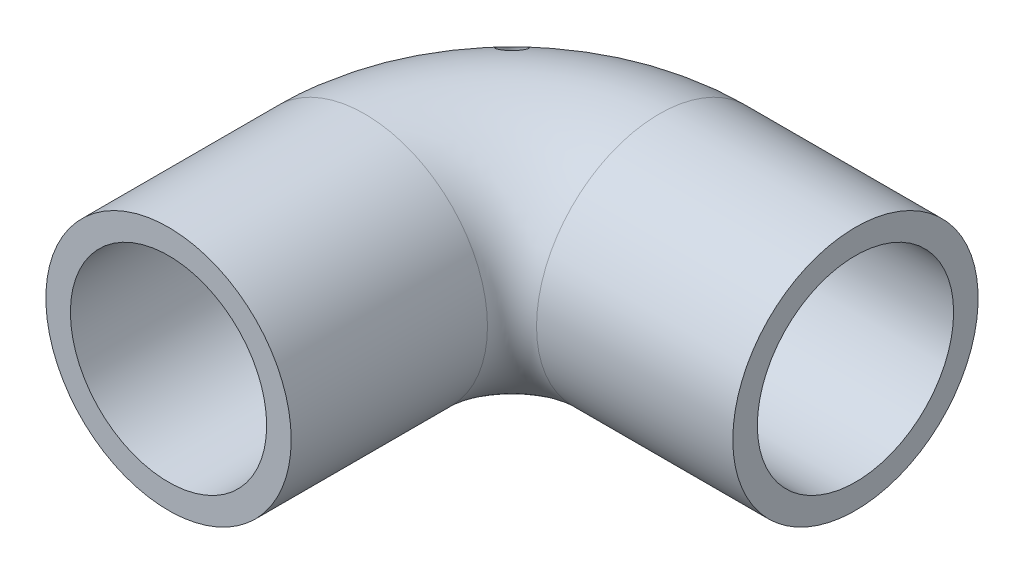
ISO-10303-21;
HEADER;
FILE_DESCRIPTION(('STEP AP214'),'2;1');
FILE_NAME('part.step','',(''),(''),'','','');
FILE_SCHEMA(('AUTOMOTIVE_DESIGN { 1 0 10303 214 1 1 1 1 }'));
ENDSEC;
DATA;
#1=APPLICATION_CONTEXT('core data for automotive mechanical design processes');
#2=APPLICATION_PROTOCOL_DEFINITION('international standard','automotive_design',2000,#1);
#3=PRODUCT_CONTEXT('',#1,'mechanical');
#4=PRODUCT('Part','Part','',(#3));
#5=PRODUCT_RELATED_PRODUCT_CATEGORY('part','',(#4));
#6=PRODUCT_DEFINITION_FORMATION('','',#4);
#7=PRODUCT_DEFINITION_CONTEXT('part definition',#1,'design');
#8=PRODUCT_DEFINITION('design','',#6,#7);
#9=PRODUCT_DEFINITION_SHAPE('','',#8);
#10=(LENGTH_UNIT() NAMED_UNIT(*) SI_UNIT(.MILLI.,.METRE.));
#11=(NAMED_UNIT(*) PLANE_ANGLE_UNIT() SI_UNIT($,.RADIAN.));
#12=(NAMED_UNIT(*) SI_UNIT($,.STERADIAN.) SOLID_ANGLE_UNIT());
#13=UNCERTAINTY_MEASURE_WITH_UNIT(LENGTH_MEASURE(1.E-05),#10,'distance_accuracy_value','');
#14=(GEOMETRIC_REPRESENTATION_CONTEXT(3) GLOBAL_UNCERTAINTY_ASSIGNED_CONTEXT((#13)) GLOBAL_UNIT_ASSIGNED_CONTEXT((#10,
#11,#12)) REPRESENTATION_CONTEXT('',''));
#15=CARTESIAN_POINT('',(0.,0.,0.));
#16=DIRECTION('',(0.,0.,1.));
#17=DIRECTION('',(1.,0.,0.));
#18=AXIS2_PLACEMENT_3D('',#15,#16,#17);
#19=CARTESIAN_POINT('',(70.,0.,20.));
#20=DIRECTION('',(-1.,0.,0.));
#21=DIRECTION('',(0.,0.,1.));
#22=AXIS2_PLACEMENT_3D('',#19,#20,#21);
#23=PLANE('',#22);
#24=CARTESIAN_POINT('',(70.,0.,20.));
#25=DIRECTION('',(-1.,0.,0.));
#26=DIRECTION('',(0.,0.,1.));
#27=AXIS2_PLACEMENT_3D('',#24,#25,#26);
#28=CIRCLE('',#27,20.);
#29=CARTESIAN_POINT('',(70.,0.,40.));
#30=VERTEX_POINT('',#29);
#31=EDGE_CURVE('E121',#30,#30,#28,.T.);
#32=ORIENTED_EDGE('',*,*,#31,.T.);
#33=EDGE_LOOP('',(#32));
#34=FACE_BOUND('',#33,.T.);
#35=CARTESIAN_POINT('',(70.,0.,20.));
#36=DIRECTION('',(-1.,0.,0.));
#37=DIRECTION('',(0.,0.,1.));
#38=AXIS2_PLACEMENT_3D('',#35,#36,#37);
#39=CIRCLE('',#38,25.);
#40=CARTESIAN_POINT('',(70.,0.,45.));
#41=VERTEX_POINT('',#40);
#42=EDGE_CURVE('E50',#41,#41,#39,.T.);
#43=ORIENTED_EDGE('',*,*,#42,.F.);
#44=EDGE_LOOP('',(#43));
#45=FACE_BOUND('',#44,.T.);
#46=ADVANCED_FACE('F32',(#34,#45),#23,.F.);
#47=CARTESIAN_POINT('',(0.,0.,90.));
#48=DIRECTION('',(0.,0.,1.));
#49=DIRECTION('',(1.,0.,0.));
#50=AXIS2_PLACEMENT_3D('',#47,#48,#49);
#51=PLANE('',#50);
#52=CARTESIAN_POINT('',(0.,0.,90.));
#53=DIRECTION('',(0.,0.,1.));
#54=DIRECTION('',(1.,0.,0.));
#55=AXIS2_PLACEMENT_3D('',#52,#53,#54);
#56=CIRCLE('',#55,20.);
#57=CARTESIAN_POINT('',(20.,0.,90.));
#58=VERTEX_POINT('',#57);
#59=EDGE_CURVE('E113',#58,#58,#56,.T.);
#60=ORIENTED_EDGE('',*,*,#59,.F.);
#61=EDGE_LOOP('',(#60));
#62=FACE_BOUND('',#61,.T.);
#63=CARTESIAN_POINT('',(0.,0.,90.));
#64=DIRECTION('',(0.,0.,1.));
#65=DIRECTION('',(1.,0.,0.));
#66=AXIS2_PLACEMENT_3D('',#63,#64,#65);
#67=CIRCLE('',#66,25.);
#68=CARTESIAN_POINT('',(25.,0.,90.));
#69=VERTEX_POINT('',#68);
#70=EDGE_CURVE('E11',#69,#69,#67,.T.);
#71=ORIENTED_EDGE('',*,*,#70,.T.);
#72=EDGE_LOOP('',(#71));
#73=FACE_BOUND('',#72,.T.);
#74=ADVANCED_FACE('F53',(#62,#73),#51,.T.);
#75=CARTESIAN_POINT('',(70.,0.,20.));
#76=DIRECTION('',(-1.,0.,0.));
#77=DIRECTION('',(0.,0.,1.));
#78=AXIS2_PLACEMENT_3D('',#75,#76,#77);
#79=CYLINDRICAL_SURFACE('',#78,25.);
#80=CARTESIAN_POINT('',(30.,0.,20.));
#81=DIRECTION('',(-1.,0.,0.));
#82=DIRECTION('',(0.,0.,1.));
#83=AXIS2_PLACEMENT_3D('',#80,#81,#82);
#84=CIRCLE('',#83,25.);
#85=CARTESIAN_POINT('',(30.,0.,45.));
#86=VERTEX_POINT('',#85);
#87=EDGE_CURVE('E64',#86,#86,#84,.T.);
#88=ORIENTED_EDGE('',*,*,#87,.F.);
#89=EDGE_LOOP('',(#88));
#90=FACE_BOUND('',#89,.T.);
#91=ORIENTED_EDGE('',*,*,#42,.T.);
#92=EDGE_LOOP('',(#91));
#93=FACE_BOUND('',#92,.T.);
#94=ADVANCED_FACE('F99',(#90,#93),#79,.T.);
#95=CARTESIAN_POINT('',(30.,0.,50.));
#96=DIRECTION('',(0.,1.,0.));
#97=DIRECTION('',(0.,0.,1.));
#98=AXIS2_PLACEMENT_3D('',#95,#96,#97);
#99=TOROIDAL_SURFACE('',#98,30.,25.);
#100=CARTESIAN_POINT('',(-1.44231619319883,-21.8907451970835,22.0419902053723));
#101=CARTESIAN_POINT('',(-1.59508578838387,-21.7882153988896,21.9340750168318));
#102=CARTESIAN_POINT('',(-1.73436957035043,-21.6821850677874,21.8099608458581));
#103=CARTESIAN_POINT('',(-1.98162230161785,-21.4672130325082,21.535394866236));
#104=CARTESIAN_POINT('',(-2.0895241645288,-21.3582656271351,21.384887720601));
#105=CARTESIAN_POINT('',(-2.25866809224152,-21.1556949394587,21.0836694362793));
#106=CARTESIAN_POINT('',(-2.32410086612629,-21.0618860957824,20.9354222697774));
#107=CARTESIAN_POINT('',(-2.42559527596869,-20.8787529766887,20.6267514395709));
#108=CARTESIAN_POINT('',(-2.46170113931035,-20.7894221396998,20.4663465117152));
#109=CARTESIAN_POINT('',(-2.498229598444,-20.6340445621157,20.1660455558691));
#110=CARTESIAN_POINT('',(-2.50378455590554,-20.566656629428,20.0274628877253));
#111=CARTESIAN_POINT('',(-2.49114886864304,-20.4403720006482,19.747503379492));
#112=CARTESIAN_POINT('',(-2.47298262007246,-20.381466649755,19.6061295571664));
#113=CARTESIAN_POINT('',(-2.41619155197144,-20.2838083907406,19.3467346983942));
#114=CARTESIAN_POINT('',(-2.38125554539665,-20.2433417428258,19.2285555040712));
#115=CARTESIAN_POINT('',(-2.29290292519107,-20.1728764511586,18.99598888701));
#116=CARTESIAN_POINT('',(-2.23949557655604,-20.1428725745335,18.8815995947646));
#117=CARTESIAN_POINT('',(-2.11419281334532,-20.0951849793816,18.6596613412832));
#118=CARTESIAN_POINT('',(-2.04219483273119,-20.0775716954466,18.5521545946519));
#119=CARTESIAN_POINT('',(-1.88157567237492,-20.056365810975,18.3488092571606));
#120=CARTESIAN_POINT('',(-1.79296266894897,-20.0527663330724,18.2529649652541));
#121=CARTESIAN_POINT('',(-1.61170702174315,-20.0595133256802,18.0852888968907));
#122=CARTESIAN_POINT('',(-1.52033473502802,-20.0685126317721,18.0120185704128));
#123=CARTESIAN_POINT('',(-1.32947641184281,-20.0974805160227,17.8796269624619));
#124=CARTESIAN_POINT('',(-1.22999014163988,-20.1174494102684,17.8205060887736));
#125=CARTESIAN_POINT('',(-1.02494004218014,-20.1673515069452,17.7168387467434));
#126=CARTESIAN_POINT('',(-0.919329690103732,-20.1973725090683,17.6724278109711));
#127=CARTESIAN_POINT('',(-0.705541118843986,-20.2657543056126,17.5989577128579));
#128=CARTESIAN_POINT('',(-0.597362026260551,-20.3041179738763,17.5699038525116));
#129=CARTESIAN_POINT('',(-0.367264288070406,-20.3927318609615,17.5240099030193));
#130=CARTESIAN_POINT('',(-0.245299595040571,-20.4438650872409,17.5091225649858));
#131=CARTESIAN_POINT('',(-0.00338335794798425,-20.5525182110665,17.4970655830426));
#132=CARTESIAN_POINT('',(0.116566979713132,-20.6100417890621,17.4999062018522));
#133=CARTESIAN_POINT('',(0.372861799437715,-20.7399493436596,17.524064069082));
#134=CARTESIAN_POINT('',(0.508482703812037,-20.8131885681392,17.5484715696204));
#135=CARTESIAN_POINT('',(0.771966665139713,-20.963518751281,17.6182635461716));
#136=CARTESIAN_POINT('',(0.899824885426074,-21.0406120578442,17.6636609515786));
#137=CARTESIAN_POINT('',(1.16372617211347,-21.208074729394,17.7819847057811));
#138=CARTESIAN_POINT('',(1.29822262886817,-21.2987339433947,17.8579704742899));
#139=CARTESIAN_POINT('',(1.55118933758139,-21.4798240195878,18.0333981891677));
#140=CARTESIAN_POINT('',(1.66965185794227,-21.5702547511266,18.1328513886194));
#141=CARTESIAN_POINT('',(1.89334267790564,-21.7534641371644,18.3592798304049));
#142=CARTESIAN_POINT('',(1.99746061481144,-21.8460913453407,18.4874830284147));
#143=CARTESIAN_POINT('',(2.17982468987654,-22.025605443651,18.7647383244829));
#144=CARTESIAN_POINT('',(2.25807494729769,-22.1124932459834,18.9137870976325));
#145=CARTESIAN_POINT('',(2.38074888365382,-22.2733278049602,19.2203635081484));
#146=CARTESIAN_POINT('',(2.42674261427841,-22.347715936813,19.3770258917309));
#147=CARTESIAN_POINT('',(2.48744861941868,-22.4863129490414,19.7006267563252));
#148=CARTESIAN_POINT('',(2.50218862742882,-22.5505308073029,19.8675559913912));
#149=CARTESIAN_POINT('',(2.49756894251179,-22.6595986140875,20.1854543799206));
#150=CARTESIAN_POINT('',(2.48200318938247,-22.7058363843146,20.3360012012274));
#151=CARTESIAN_POINT('',(2.42287776937774,-22.7869994290869,20.6346392465823));
#152=CARTESIAN_POINT('',(2.3793421030242,-22.8219343638023,20.7827324643753));
#153=CARTESIAN_POINT('',(2.27111393516653,-22.8760116849631,21.0539931586871));
#154=CARTESIAN_POINT('',(2.20938710415744,-22.8964973792314,21.1780809421201));
#155=CARTESIAN_POINT('',(2.06552143879753,-22.9270332543711,21.4152098202499));
#156=CARTESIAN_POINT('',(1.98339254492705,-22.9370885049466,21.528256257353));
#157=CARTESIAN_POINT('',(1.8074075732455,-22.9461500070103,21.7320998711461));
#158=CARTESIAN_POINT('',(1.71473158582905,-22.945862311114,21.8238881327554));
#159=CARTESIAN_POINT('',(1.51653619775506,-22.9359855511519,21.9917256466232));
#160=CARTESIAN_POINT('',(1.41101881727818,-22.9263979484776,22.0677773694504));
#161=CARTESIAN_POINT('',(1.19199961088695,-22.8983806068556,22.2012152932228));
#162=CARTESIAN_POINT('',(1.07863568600704,-22.8800810464058,22.2588560672379));
#163=CARTESIAN_POINT('',(0.845939799992847,-22.8351535971569,22.3559038614617));
#164=CARTESIAN_POINT('',(0.726607449846541,-22.8085251648998,22.3953096914264));
#165=CARTESIAN_POINT('',(0.481146099357136,-22.7465249492099,22.4566331800481));
#166=CARTESIAN_POINT('',(0.35492438496345,-22.7108845087411,22.4779043764407));
#167=CARTESIAN_POINT('',(0.103012165397152,-22.632215908892,22.5010808743971));
#168=CARTESIAN_POINT('',(-0.0226780958228628,-22.5891846693692,22.50297808177));
#169=CARTESIAN_POINT('',(-0.280047551947165,-22.4931410849168,22.4878582839392));
#170=CARTESIAN_POINT('',(-0.41144781865258,-22.4396166283587,22.46938104977));
#171=CARTESIAN_POINT('',(-0.667085002060908,-22.3263751067309,22.4129101085158));
#172=CARTESIAN_POINT('',(-0.791324054076701,-22.2666599026214,22.3749222528919));
#173=CARTESIAN_POINT('',(-1.00601230326072,-22.1549277654593,22.2909385465051));
#174=CARTESIAN_POINT('',(-1.09820144029576,-22.1038085230828,22.2481332446062));
#175=CARTESIAN_POINT('',(-1.27564450871108,-21.9990400258,22.1524184730185));
#176=CARTESIAN_POINT('',(-1.36089566974498,-21.9453897736333,22.0995049950721));
#177=CARTESIAN_POINT('',(-1.44231619319883,-21.8907451970835,22.0419902053723));
#178=B_SPLINE_CURVE_WITH_KNOTS('',3,(#100,#101,#102,#103,#104,#105,#106,#107,#108,#109,#110,
#111,#112,#113,#114,#115,#116,#117,#118,#119,#120,#121,#122,#123,#124,#125,#126,#127,#128,#129,
#130,#131,#132,#133,#134,#135,#136,#137,#138,#139,#140,#141,#142,#143,#144,#145,#146,#147,#148,
#149,#150,#151,#152,#153,#154,#155,#156,#157,#158,#159,#160,#161,#162,#163,#164,#165,#166,#167,
#168,#169,#170,#171,#172,#173,#174,#175,#176,#177),.UNSPECIFIED.,.T.,.F.,(4,2,2,2,2,2,2,2,2,2,2,
2,2,2,2,2,2,2,2,2,2,2,2,2,2,2,2,2,2,2,2,2,2,2,2,2,2,2,4),(0.,0.639357510660795,1.28007192103898,
1.83924015490096,2.39756354333956,2.85833696745401,3.31863688063712,3.70615922437103,
4.09348747293513,4.48300008418614,4.87232151548803,5.22304734352844,5.57378327820994,
5.92766628408931,6.2816713875796,6.67941827650512,7.07739544256795,7.54374073539276,
8.01037367180548,8.54539326314644,9.08066992986614,9.64587658506757,10.2109931913332,
10.7462239326989,11.2809795293307,11.7530631444212,12.2247422124015,12.6428320364338,
13.0607185530756,13.4501362862071,13.8394928359691,14.2232057765654,14.6069437596081,
15.003848847685,15.4009197505635,15.8284118319235,16.2557757782621,16.5963942496346,
16.9371480699815),.UNSPECIFIED.);
#179=CARTESIAN_POINT('',(-1.44231619319883,-21.8907451970835,22.0419902053723));
#180=VERTEX_POINT('',#179);
#181=EDGE_CURVE('E92',#180,#180,#178,.T.);
#182=ORIENTED_EDGE('',*,*,#181,.F.);
#183=EDGE_LOOP('',(#182));
#184=FACE_BOUND('',#183,.T.);
#185=CARTESIAN_POINT('',(-1.7677669529668,20.0549838672483,18.2322330470332));
#186=CARTESIAN_POINT('',(-1.85460818030549,20.0549853816918,18.3190768997089));
#187=CARTESIAN_POINT('',(-1.93502617486619,20.0613880166193,18.4123643252665));
#188=CARTESIAN_POINT('',(-2.08064685596244,20.0865138791103,18.6086475707806));
#189=CARTESIAN_POINT('',(-2.14584312298506,20.1052422921981,18.7116474611942));
#190=CARTESIAN_POINT('',(-2.25951712208122,20.1536073993731,18.9234421224409));
#191=CARTESIAN_POINT('',(-2.30806451825132,20.1831975401736,19.0322104920869));
#192=CARTESIAN_POINT('',(-2.38864218932101,20.2515730071068,19.252870818484));
#193=CARTESIAN_POINT('',(-2.42066812770525,20.2903607435083,19.3647635872047));
#194=CARTESIAN_POINT('',(-2.47044159394079,20.3784571419872,19.5973937660077));
#195=CARTESIAN_POINT('',(-2.48696423958258,20.4283301612267,19.7181758190106));
#196=CARTESIAN_POINT('',(-2.5025369820298,20.5345281019273,19.9579761071623));
#197=CARTESIAN_POINT('',(-2.50157941161555,20.5908558438118,20.0769935454036));
#198=CARTESIAN_POINT('',(-2.4817188385092,20.718418021112,20.3318546569677));
#199=CARTESIAN_POINT('',(-2.4597159251574,20.790539129644,20.4670137754705));
#200=CARTESIAN_POINT('',(-2.394901578838,20.9388039564797,20.7299360645513));
#201=CARTESIAN_POINT('',(-2.3520763605874,21.0149503098648,20.8576942726027));
#202=CARTESIAN_POINT('',(-2.23928392945397,21.1807998691912,21.1221559811556));
#203=CARTESIAN_POINT('',(-2.16621645988361,21.2708281382724,21.2573420220641));
#204=CARTESIAN_POINT('',(-1.99667791015285,21.4509164810857,21.5121905159207));
#205=CARTESIAN_POINT('',(-1.9001954781656,21.5409765490227,21.6318453958762));
#206=CARTESIAN_POINT('',(-1.67924761096483,21.7242384531097,21.8592397750967));
#207=CARTESIAN_POINT('',(-1.55342217543108,21.8172909168834,21.9657873420705));
#208=CARTESIAN_POINT('',(-1.28057828722542,21.997950612703,22.1534894615611));
#209=CARTESIAN_POINT('',(-1.1335621857572,22.0855584473147,22.2346468280764));
#210=CARTESIAN_POINT('',(-0.829677164410925,22.2485156085044,22.3638047341428));
#211=CARTESIAN_POINT('',(-0.673614999924391,22.3242507027779,22.4132046134897));
#212=CARTESIAN_POINT('',(-0.350521353984448,22.4656970474226,22.4807860733784));
#213=CARTESIAN_POINT('',(-0.1834994999856,22.5314169313141,22.49899468235));
#214=CARTESIAN_POINT('',(0.135574946461175,22.6435091661677,22.5008133721967));
#215=CARTESIAN_POINT('',(0.287127206894456,22.6912396434279,22.4881781790104));
#216=CARTESIAN_POINT('',(0.588366739180557,22.7753767440659,22.4345761773574));
#217=CARTESIAN_POINT('',(0.738055523374273,22.8117932147422,22.3936341068515));
#218=CARTESIAN_POINT('',(1.0125714300384,22.8685488157315,22.2899136708376));
#219=CARTESIAN_POINT('',(1.13827606985633,22.890256787377,22.2301942561125));
#220=CARTESIAN_POINT('',(1.37897681277669,22.9231756691262,22.0899258760441));
#221=CARTESIAN_POINT('',(1.49397830426323,22.9343918872139,22.0093874697898));
#222=CARTESIAN_POINT('',(1.70150829570521,22.9455840811497,21.8362544012195));
#223=CARTESIAN_POINT('',(1.79505229081626,22.9463010010195,21.7449203341522));
#224=CARTESIAN_POINT('',(1.96658254566801,22.9383778080415,21.5490291736848));
#225=CARTESIAN_POINT('',(2.04457152521971,22.929739332696,21.4444743971731));
#226=CARTESIAN_POINT('',(2.18174770656883,22.9035646562548,21.2272723116252));
#227=CARTESIAN_POINT('',(2.24123603594225,22.8861845134154,21.1147957129013));
#228=CARTESIAN_POINT('',(2.34207384305446,22.8430467721755,20.8835212174158));
#229=CARTESIAN_POINT('',(2.38342187509337,22.8172885063611,20.7647228176808));
#230=CARTESIAN_POINT('',(2.44863488908146,22.7570603433062,20.5202843010581));
#231=CARTESIAN_POINT('',(2.47189903776141,22.7223383889231,20.3945468625623));
#232=CARTESIAN_POINT('',(2.49909079031989,22.6454595002629,20.143282233812));
#233=CARTESIAN_POINT('',(2.50301332231788,22.6033006188295,20.0177551073323));
#234=CARTESIAN_POINT('',(2.49208337647855,22.5090987427776,19.7606744276464));
#235=CARTESIAN_POINT('',(2.47581365966037,22.4565539838223,19.6293664746184));
#236=CARTESIAN_POINT('',(2.42374779451911,22.3451771383892,19.3734888150312));
#237=CARTESIAN_POINT('',(2.38794388164464,22.2863425592839,19.2489218095539));
#238=CARTESIAN_POINT('',(2.29404694128736,22.1571634265784,18.996329934007));
#239=CARTESIAN_POINT('',(2.234008132057,22.0862589862181,18.8693155897094));
#240=CARTESIAN_POINT('',(2.09511711377594,21.9399089389263,18.6289500865444));
#241=CARTESIAN_POINT('',(2.01625676871606,21.8644613787094,18.5156048684308));
#242=CARTESIAN_POINT('',(1.83255353658559,21.7020392154472,18.2927043090167));
#243=CARTESIAN_POINT('',(1.72579461243547,21.6147169490975,18.1849785833992));
#244=CARTESIAN_POINT('',(1.49533666305047,21.4386085728836,17.9908465595936));
#245=CARTESIAN_POINT('',(1.37162609001995,21.3498215017472,17.9044549079896));
#246=CARTESIAN_POINT('',(1.1004885683424,21.1665558109182,17.7494232652306));
#247=CARTESIAN_POINT('',(0.951982101949942,21.0721449282229,17.6825810657234));
#248=CARTESIAN_POINT('',(0.642401245368974,20.8876475070954,17.5784378448192));
#249=CARTESIAN_POINT('',(0.48133265739565,20.797559002929,17.5411232728812));
#250=CARTESIAN_POINT('',(0.180027971348788,20.6409928770036,17.5027219671814));
#251=CARTESIAN_POINT('',(0.0411608109753367,20.5731608433582,17.4963854755735));
#252=CARTESIAN_POINT('',(-0.239470926012316,20.445952805121,17.5075487510223));
#253=CARTESIAN_POINT('',(-0.381231942276568,20.3865670506297,17.5250207841669));
#254=CARTESIAN_POINT('',(-0.641393568712038,20.2880160384218,17.5806194060423));
#255=CARTESIAN_POINT('',(-0.759935318260687,20.2471377273793,17.6150331539803));
#256=CARTESIAN_POINT('',(-0.993284522682769,20.17584657623,17.7024226378212));
#257=CARTESIAN_POINT('',(-1.10809525466315,20.1454243141204,17.7553815751995));
#258=CARTESIAN_POINT('',(-1.31842436366959,20.0996195425188,17.872869827438));
#259=CARTESIAN_POINT('',(-1.41469385145631,20.0829781932477,17.9355604407488));
#260=CARTESIAN_POINT('',(-1.5984630926939,20.0606608291696,18.0743411601386));
#261=CARTESIAN_POINT('',(-1.68596474065139,20.0549824406813,18.1504283617175));
#262=CARTESIAN_POINT('',(-1.7677669529668,20.0549838672483,18.2322330470332));
#263=B_SPLINE_CURVE_WITH_KNOTS('',3,(#185,#186,#187,#188,#189,#190,#191,#192,#193,#194,#195,
#196,#197,#198,#199,#200,#201,#202,#203,#204,#205,#206,#207,#208,#209,#210,#211,#212,#213,#214,
#215,#216,#217,#218,#219,#220,#221,#222,#223,#224,#225,#226,#227,#228,#229,#230,#231,#232,#233,
#234,#235,#236,#237,#238,#239,#240,#241,#242,#243,#244,#245,#246,#247,#248,#249,#250,#251,#252,
#253,#254,#255,#256,#257,#258,#259,#260,#261,#262),.UNSPECIFIED.,.T.,.F.,(4,2,2,2,2,2,2,2,2,2,2,
2,2,2,2,2,2,2,2,2,2,2,2,2,2,2,2,2,2,2,2,2,2,2,2,2,2,2,4),(0.,0.367980979668445,
0.736116870056631,1.1026930124365,1.46936532401046,1.86303452410346,2.2568764005941,
2.71938981191288,3.18220984527912,3.71421123557763,4.24647106295986,4.81159606022909,
5.37665840243045,5.91471354421712,6.45230220432911,6.92777278190171,7.40282836034063,
7.82315653735078,8.24327194689191,8.63358407883551,9.02382790434346,9.40733993895211,
9.79088253219085,10.1866801049322,10.5825814606881,11.0079105877856,11.4334089001629,
11.9035892268903,12.3739731683558,12.8967710595024,13.4199268779441,13.9819859880278,
14.5437870134064,15.0059915508028,15.4676581385342,15.856147805847,16.244286479501,
16.5909902151759,16.9376188747349),.UNSPECIFIED.);
#264=CARTESIAN_POINT('',(-1.7677669529668,20.0549838672483,18.2322330470332));
#265=VERTEX_POINT('',#264);
#266=EDGE_CURVE('E87',#265,#265,#263,.T.);
#267=ORIENTED_EDGE('',*,*,#266,.F.);
#268=EDGE_LOOP('',(#267));
#269=FACE_BOUND('',#268,.T.);
#270=CARTESIAN_POINT('',(0.,0.,50.));
#271=DIRECTION('',(0.,0.,1.));
#272=DIRECTION('',(1.,0.,0.));
#273=AXIS2_PLACEMENT_3D('',#270,#271,#272);
#274=CIRCLE('',#273,25.);
#275=CARTESIAN_POINT('',(25.,0.,50.));
#276=VERTEX_POINT('',#275);
#277=EDGE_CURVE('E44',#276,#276,#274,.T.);
#278=ORIENTED_EDGE('',*,*,#277,.F.);
#279=EDGE_LOOP('',(#278));
#280=FACE_BOUND('',#279,.T.);
#281=ORIENTED_EDGE('',*,*,#87,.T.);
#282=EDGE_LOOP('',(#281));
#283=FACE_BOUND('',#282,.T.);
#284=ADVANCED_FACE('F59',(#184,#269,#280,#283),#99,.T.);
#285=CARTESIAN_POINT('',(0.,0.,50.));
#286=DIRECTION('',(0.,0.,1.));
#287=DIRECTION('',(1.,0.,0.));
#288=AXIS2_PLACEMENT_3D('',#285,#286,#287);
#289=CYLINDRICAL_SURFACE('',#288,25.);
#290=ORIENTED_EDGE('',*,*,#70,.F.);
#291=EDGE_LOOP('',(#290));
#292=FACE_BOUND('',#291,.T.);
#293=ORIENTED_EDGE('',*,*,#277,.T.);
#294=EDGE_LOOP('',(#293));
#295=FACE_BOUND('',#294,.T.);
#296=ADVANCED_FACE('F55',(#292,#295),#289,.T.);
#297=CARTESIAN_POINT('',(70.,0.,20.));
#298=DIRECTION('',(-1.,0.,0.));
#299=DIRECTION('',(0.,0.,1.));
#300=AXIS2_PLACEMENT_3D('',#297,#298,#299);
#301=CYLINDRICAL_SURFACE('',#300,20.);
#302=CARTESIAN_POINT('',(30.,0.,20.));
#303=DIRECTION('',(1.,0.,0.));
#304=DIRECTION('',(0.,0.,-1.));
#305=AXIS2_PLACEMENT_3D('',#302,#303,#304);
#306=CIRCLE('',#305,20.);
#307=CARTESIAN_POINT('',(30.,0.,0.));
#308=VERTEX_POINT('',#307);
#309=EDGE_CURVE('E118',#308,#308,#306,.F.);
#310=ORIENTED_EDGE('',*,*,#309,.T.);
#311=EDGE_LOOP('',(#310));
#312=FACE_BOUND('',#311,.T.);
#313=ORIENTED_EDGE('',*,*,#31,.F.);
#314=EDGE_LOOP('',(#313));
#315=FACE_BOUND('',#314,.T.);
#316=ADVANCED_FACE('F58',(#312,#315),#301,.F.);
#317=CARTESIAN_POINT('',(30.,0.,50.));
#318=DIRECTION('',(0.,1.,0.));
#319=DIRECTION('',(0.,0.,1.));
#320=AXIS2_PLACEMENT_3D('',#317,#318,#319);
#321=TOROIDAL_SURFACE('',#320,30.,20.);
#322=CARTESIAN_POINT('',(1.76776705351832,-17.3627890548312,21.7677670535183));
#323=CARTESIAN_POINT('',(1.67950582896888,-17.3627902056728,21.8560326270273));
#324=CARTESIAN_POINT('',(1.58461807210331,-17.3570939382639,21.9376369119716));
#325=CARTESIAN_POINT('',(1.38463191220159,-17.3345199191791,22.0852419741478));
#326=CARTESIAN_POINT('',(1.27953538538498,-17.3176442188106,22.1512456109193));
#327=CARTESIAN_POINT('',(1.0628225215438,-17.273350634866,22.2661472262858));
#328=CARTESIAN_POINT('',(0.951222209297472,-17.245957804582,22.3150853327056));
#329=CARTESIAN_POINT('',(0.724666957747373,-17.1814986745404,22.3956890733607));
#330=CARTESIAN_POINT('',(0.609711331062228,-17.144430380103,22.4273511418286));
#331=CARTESIAN_POINT('',(0.374261958552158,-17.0597697760605,22.47487547669));
#332=CARTESIAN_POINT('',(0.253756182884961,-17.0117725381856,22.4899459002108));
#333=CARTESIAN_POINT('',(0.0154176124930881,-16.9076357670098,22.5028033905566));
#334=CARTESIAN_POINT('',(-0.102414255747829,-16.8514934598689,22.5005845558237));
#335=CARTESIAN_POINT('',(-0.348554951147514,-16.7243557330497,22.4790605948258));
#336=CARTESIAN_POINT('',(-0.476156537877984,-16.652378047815,22.4575093746674));
#337=CARTESIAN_POINT('',(-0.722583198703645,-16.5013142365497,22.3966664642168));
#338=CARTESIAN_POINT('',(-0.841402941915056,-16.4222238563951,22.3573640996316));
#339=CARTESIAN_POINT('',(-1.08861107664549,-16.2441022399692,22.2551742051419));
#340=CARTESIAN_POINT('',(-1.21502035288487,-16.1440070792618,22.1893583867773));
#341=CARTESIAN_POINT('',(-1.45185368619288,-15.9383519523572,22.0400367105507));
#342=CARTESIAN_POINT('',(-1.56226993189821,-15.8327893496783,21.9565222569897));
#343=CARTESIAN_POINT('',(-1.78506082193744,-15.5981688955431,21.7577767478342));
#344=CARTESIAN_POINT('',(-1.89399734967003,-15.4683858940122,21.6395359793907));
#345=CARTESIAN_POINT('',(-2.08679712569297,-15.2067350345048,21.3859020876993));
#346=CARTESIAN_POINT('',(-2.17062428359351,-15.0748644597103,21.2504846698725));
#347=CARTESIAN_POINT('',(-2.32083108746548,-14.7949583007175,20.9466174049233));
#348=CARTESIAN_POINT('',(-2.38351197946955,-14.6470563076702,20.7761626834357));
#349=CARTESIAN_POINT('',(-2.44924791915706,-14.4307088532826,20.5094656139985));
#350=CARTESIAN_POINT('',(-2.46644547011414,-14.3595150078323,20.4187369231875));
#351=CARTESIAN_POINT('',(-2.49077507084617,-14.2198528451923,20.2339226464393));
#352=CARTESIAN_POINT('',(-2.49791268796547,-14.1513830408761,20.1398389468067));
#353=CARTESIAN_POINT('',(-2.50179237579036,-13.9990748984687,19.9211316639131));
#354=CARTESIAN_POINT('',(-2.49494143458386,-13.9165013296431,19.795527822576));
#355=CARTESIAN_POINT('',(-2.4608493460039,-13.7612638700921,19.5410432770309));
#356=CARTESIAN_POINT('',(-2.43364496634314,-13.68858238917,19.4121688860141));
#357=CARTESIAN_POINT('',(-2.36502644854476,-13.572588943173,19.1829560511471));
#358=CARTESIAN_POINT('',(-2.3282017894977,-13.526350259616,19.0827380903799));
#359=CARTESIAN_POINT('',(-2.23971600269867,-13.4454451413616,18.8840066077554));
#360=CARTESIAN_POINT('',(-2.18806460369199,-13.4107711504996,18.7854920130089));
#361=CARTESIAN_POINT('',(-2.09916372318855,-13.3695176995867,18.6410393957779));
#362=CARTESIAN_POINT('',(-2.0674164953652,-13.3575232652958,18.5931843203412));
#363=CARTESIAN_POINT('',(-2.00026668903947,-13.3375487914582,18.4992473624777));
#364=CARTESIAN_POINT('',(-1.96486609728959,-13.3295665837256,18.4531645347988));
#365=CARTESIAN_POINT('',(-1.89065925265283,-13.3178559541433,18.3632958819217));
#366=CARTESIAN_POINT('',(-1.85185506206611,-13.3141249753144,18.3195086911077));
#367=CARTESIAN_POINT('',(-1.77119987718369,-13.311015580416,18.2347007021665));
#368=CARTESIAN_POINT('',(-1.72934930467001,-13.3116365629324,18.1936795225848));
#369=CARTESIAN_POINT('',(-1.61297118135784,-13.319182288794,18.0873804166675));
#370=CARTESIAN_POINT('',(-1.53594374136866,-13.3301872860594,18.0250528292848));
#371=CARTESIAN_POINT('',(-1.37683825484728,-13.3637797111231,17.9109957589173));
#372=CARTESIAN_POINT('',(-1.29475799606233,-13.3863722444369,17.8592709616377));
#373=CARTESIAN_POINT('',(-1.1069936384588,-13.4483643489575,17.7552816987548));
#374=CARTESIAN_POINT('',(-1.00052675960423,-13.4905498829433,17.7060978948843));
#375=CARTESIAN_POINT('',(-0.786666022124957,-13.5868180637882,17.624218800786));
#376=CARTESIAN_POINT('',(-0.679270889972765,-13.6409209253403,17.5915518412097));
#377=CARTESIAN_POINT('',(-0.426461402267074,-13.7793298275283,17.5320783013351));
#378=CARTESIAN_POINT('',(-0.281590399699812,-13.8674260261007,17.5118453392884));
#379=CARTESIAN_POINT('',(0.00275956952861399,-14.053828660327,17.4959353593294));
#380=CARTESIAN_POINT('',(0.142228558175278,-14.1521528589841,17.5003017864253));
#381=CARTESIAN_POINT('',(0.456709629371237,-14.3866724686436,17.5355159861261));
#382=CARTESIAN_POINT('',(0.629188085174908,-14.5250911427841,17.5742223406987));
#383=CARTESIAN_POINT('',(0.959262453569418,-14.8062503473488,17.6848046686347));
#384=CARTESIAN_POINT('',(1.11684728550122,-14.9489939928397,17.7567051075391));
#385=CARTESIAN_POINT('',(1.4156923608935,-15.2359033397601,17.9321180300905));
#386=CARTESIAN_POINT('',(1.55676255527731,-15.380068133062,18.0359564546712));
#387=CARTESIAN_POINT('',(1.8163431248356,-15.6642729814902,18.2732227487857));
#388=CARTESIAN_POINT('',(1.93487155177525,-15.8043162605629,18.4066267548066));
#389=CARTESIAN_POINT('',(2.12678034815241,-16.0542012448929,18.6772397330111));
#390=CARTESIAN_POINT('',(2.20436275803643,-16.1652631848473,18.8103401697259));
#391=CARTESIAN_POINT('',(2.3353338092758,-16.3788685269887,19.0941514804993));
#392=CARTESIAN_POINT('',(2.38875179329246,-16.4814221364685,19.2448407152482));
#393=CARTESIAN_POINT('',(2.45962562175769,-16.6578340404118,19.5328496013182));
#394=CARTESIAN_POINT('',(2.48174862953372,-16.7335692208362,19.6678718328165));
#395=CARTESIAN_POINT('',(2.50324226990675,-16.8751186777021,19.9450031713997));
#396=CARTESIAN_POINT('',(2.50261789503563,-16.9409351278946,20.0871107165823));
#397=CARTESIAN_POINT('',(2.48266181894932,-17.0307057325806,20.3028014513146));
#398=CARTESIAN_POINT('',(2.47275162717744,-17.0592449151114,20.3754529202829));
#399=CARTESIAN_POINT('',(2.44626998853026,-17.1129422005574,20.5207760425815));
#400=CARTESIAN_POINT('',(2.42970209000488,-17.1381020950121,20.5934476645859));
#401=CARTESIAN_POINT('',(2.38974291727366,-17.1847668151369,20.7380739550626));
#402=CARTESIAN_POINT('',(2.36635351856929,-17.2062726428864,20.8100288149854));
#403=CARTESIAN_POINT('',(2.31273204811741,-17.2453819295482,20.9524008307871));
#404=CARTESIAN_POINT('',(2.2825010146711,-17.262985979801,21.0228182182198));
#405=CARTESIAN_POINT('',(2.18898703448311,-17.3061950835476,21.2153366735243));
#406=CARTESIAN_POINT('',(2.11829944827345,-17.3273536962266,21.3349780342576));
#407=CARTESIAN_POINT('',(1.95708968600862,-17.3556451756745,21.5617793593967));
#408=CARTESIAN_POINT('',(1.86658130958612,-17.3627877663883,21.6689479285038));
#409=CARTESIAN_POINT('',(1.76776705351832,-17.3627890548312,21.7677670535183));
#410=B_SPLINE_CURVE_WITH_KNOTS('',3,(#322,#323,#324,#325,#326,#327,#328,#329,#330,#331,#332,
#333,#334,#335,#336,#337,#338,#339,#340,#341,#342,#343,#344,#345,#346,#347,#348,#349,#350,#351,
#352,#353,#354,#355,#356,#357,#358,#359,#360,#361,#362,#363,#364,#365,#366,#367,#368,#369,#370,
#371,#372,#373,#374,#375,#376,#377,#378,#379,#380,#381,#382,#383,#384,#385,#386,#387,#388,#389,
#390,#391,#392,#393,#394,#395,#396,#397,#398,#399,#400,#401,#402,#403,#404,#405,#406,#407,#408,
#409),.UNSPECIFIED.,.T.,.F.,(4,2,2,2,2,2,2,2,2,2,2,2,2,2,2,2,2,2,2,2,2,2,2,2,2,2,2,2,2,2,2,2,2,
2,2,2,2,2,2,2,2,2,2,4),(0.,0.373955320156109,0.74784204247375,1.12084358501238,1.49392208582866,
1.88412341387183,2.27445794002785,2.71701143077672,3.15983139719689,3.68034883823678,
4.20111966079712,4.81851948746954,5.4368025080831,6.13568113177719,6.48507569123656,
6.83427681357438,7.28421805288843,7.73334844707135,8.08116891563357,8.42876167723465,
8.60452979352185,8.78020282326169,8.9557701353921,9.13131318569281,9.42882930223306,
9.72647661834316,10.098333063009,10.4708251918726,10.9803085561204,11.4906920012508,
12.1607759341527,12.8313545396299,13.5090174772131,14.1861354263072,14.7536888235629,
15.3205511832048,15.7878931264773,16.2551324994663,16.490885405492,16.7265128288731,
16.9620755298855,17.1976025053401,17.6165608898393,18.0352285091982),.UNSPECIFIED.);
#411=CARTESIAN_POINT('',(1.76776705351832,-17.3627890548312,21.7677670535183));
#412=VERTEX_POINT('',#411);
#413=EDGE_CURVE('E35',#412,#412,#410,.T.);
#414=ORIENTED_EDGE('',*,*,#413,.T.);
#415=EDGE_LOOP('',(#414));
#416=FACE_BOUND('',#415,.T.);
#417=CARTESIAN_POINT('',(-1.76776695296647,13.3117383506289,18.2322330470335));
#418=CARTESIAN_POINT('',(-1.84629938218955,13.3117391388282,18.3107663825716));
#419=CARTESIAN_POINT('',(-1.91955767146091,13.3196528795364,18.3945796701918));
#420=CARTESIAN_POINT('',(-2.05318988042745,13.3504262973604,18.5694234701596));
#421=CARTESIAN_POINT('',(-2.11355309018946,13.3732983344695,18.660459896255));
#422=CARTESIAN_POINT('',(-2.22005395405118,13.4315489015321,18.8455773130325));
#423=CARTESIAN_POINT('',(-2.26630089816816,13.4668265476985,18.9396283416481));
#424=CARTESIAN_POINT('',(-2.34558830739956,13.5473635096522,19.1289271272046));
#425=CARTESIAN_POINT('',(-2.37862186339158,13.5926280283132,19.2241754834374));
#426=CARTESIAN_POINT('',(-2.44498718123691,13.7137903687012,19.4586552444147));
#427=CARTESIAN_POINT('',(-2.47122208175039,13.7941100697205,19.5976071515044));
#428=CARTESIAN_POINT('',(-2.50049376216948,13.9654656032361,19.8713166992613));
#429=CARTESIAN_POINT('',(-2.50347442105666,14.0565268221934,20.0060634119422));
#430=CARTESIAN_POINT('',(-2.48645223905425,14.2773410693858,20.3142998764783));
#431=CARTESIAN_POINT('',(-2.45831699100718,14.4097471933773,20.4854415307769));
#432=CARTESIAN_POINT('',(-2.36979144847195,14.6800291872562,20.8143157203748));
#433=CARTESIAN_POINT('',(-2.30938560355105,14.8179076644638,20.972041748491));
#434=CARTESIAN_POINT('',(-2.15788320376854,15.0968038583884,21.2737351956233));
#435=CARTESIAN_POINT('',(-2.06635955005911,15.2378382554678,21.4174732509299));
#436=CARTESIAN_POINT('',(-1.85461054071396,15.5173500942505,21.6851052874848));
#437=CARTESIAN_POINT('',(-1.73436936348677,15.6558260809582,21.8089882667128));
#438=CARTESIAN_POINT('',(-1.45872688484523,15.9345152218968,22.0386381159704));
#439=CARTESIAN_POINT('',(-1.30168950412792,16.0743624310365,22.1429355426299));
#440=CARTESIAN_POINT('',(-1.04587824734646,16.274844018546,22.272725861874));
#441=CARTESIAN_POINT('',(-0.957269973521911,16.3400996707451,22.3115368454254));
#442=CARTESIAN_POINT('',(-0.773850106910263,16.4668941875082,22.3792225045103));
#443=CARTESIAN_POINT('',(-0.679042270157133,16.5284352598889,22.4081031312166));
#444=CARTESIAN_POINT('',(-0.45208812588212,16.6664623012093,22.4623811906796));
#445=CARTESIAN_POINT('',(-0.317863087179908,16.7412616616648,22.4835575764398));
#446=CARTESIAN_POINT('',(-0.0426392621264236,16.8809842760219,22.5034293011529));
#447=CARTESIAN_POINT('',(0.0983556946236292,16.9459130288968,22.5021372040701));
#448=CARTESIAN_POINT('',(0.312264553879559,17.0344770121183,22.4814720972498));
#449=CARTESIAN_POINT('',(0.384299699911007,17.062633209884,22.4713742810866));
#450=CARTESIAN_POINT('',(0.528362623281528,17.1156119277968,22.4446248536412));
#451=CARTESIAN_POINT('',(0.600390384247283,17.1404362089924,22.4279767228959));
#452=CARTESIAN_POINT('',(0.743718368069606,17.1864854355744,22.3879729927494));
#453=CARTESIAN_POINT('',(0.815018788463842,17.2077113840843,22.3646192676036));
#454=CARTESIAN_POINT('',(0.956091507825726,17.2463233281022,22.3111874344561));
#455=CARTESIAN_POINT('',(1.0258640703711,17.2637099907197,22.2811104965023));
#456=CARTESIAN_POINT('',(1.21348825669968,17.3057084884773,22.1897270592027));
#457=CARTESIAN_POINT('',(1.3290866486329,17.3262723024847,22.121690996977));
#458=CARTESIAN_POINT('',(1.54877015816529,17.3543403459466,21.9670667842542));
#459=CARTESIAN_POINT('',(1.65286297725024,17.361853361395,21.8804911590088));
#460=CARTESIAN_POINT('',(1.83660911302552,17.3634800669818,21.7005344560657));
#461=CARTESIAN_POINT('',(1.91764177606891,17.3587913668306,21.6085666715948));
#462=CARTESIAN_POINT('',(2.06491218302687,17.3386588682037,21.4145548879879));
#463=CARTESIAN_POINT('',(2.1311523539876,17.3232168357725,21.3125125457811));
#464=CARTESIAN_POINT('',(2.24699216220134,17.2822622904059,21.1024101061103));
#465=CARTESIAN_POINT('',(2.29672184933807,17.2568321013908,20.9944052541821));
#466=CARTESIAN_POINT('',(2.37981259963793,17.1966762340889,20.7747825685003));
#467=CARTESIAN_POINT('',(2.41317042206293,17.161948717538,20.6631640240896));
#468=CARTESIAN_POINT('',(2.46548034241686,17.0815449914008,20.4317448735644));
#469=CARTESIAN_POINT('',(2.48332147113626,17.035292433114,20.3118957088918));
#470=CARTESIAN_POINT('',(2.50173408878972,16.9345438375412,20.0743957362563));
#471=CARTESIAN_POINT('',(2.50229861047108,16.8800444834182,19.9567458343186));
#472=CARTESIAN_POINT('',(2.48668613988071,16.7566182958306,19.7112158306505));
#473=CARTESIAN_POINT('',(2.46835555972113,16.6867376226778,19.5839555184967));
#474=CARTESIAN_POINT('',(2.41397476110012,16.5397735864584,19.3376889431405));
#475=CARTESIAN_POINT('',(2.37791447595129,16.4626861516512,19.2186874130187));
#476=CARTESIAN_POINT('',(2.28284736962906,16.2889914956378,18.9708585760282));
#477=CARTESIAN_POINT('',(2.22095032466727,16.1913143109172,18.8438921723336));
#478=CARTESIAN_POINT('',(2.07944168368572,15.9903172996251,18.6052984257145));
#479=CARTESIAN_POINT('',(1.9998210645154,15.8869946191958,18.4936789429668));
#480=CARTESIAN_POINT('',(1.80944678170222,15.6569178628913,18.2674766660061));
#481=CARTESIAN_POINT('',(1.69565600057566,15.5293896337936,18.1562287247392));
#482=CARTESIAN_POINT('',(1.45086088297746,15.2718545541139,17.9579725631096));
#483=CARTESIAN_POINT('',(1.3198344059387,15.1418447025266,17.8709959775143));
#484=CARTESIAN_POINT('',(1.02415540249444,14.864236474663,17.7124236207354));
#485=CARTESIAN_POINT('',(0.857359046470166,14.7166959386665,17.6446264335547));
#486=CARTESIAN_POINT('',(0.595895612284424,14.5000459950228,17.5703684178222));
#487=CARTESIAN_POINT('',(0.506854269382204,14.4285997953787,17.5501881124615));
#488=CARTESIAN_POINT('',(0.325320180429391,14.2880778016797,17.5195496541872));
#489=CARTESIAN_POINT('',(0.232829097217427,14.2190008956325,17.5090868786609));
#490=CARTESIAN_POINT('',(0.0121060864236333,14.0608238670871,17.4968081097808));
#491=CARTESIAN_POINT('',(-0.117390146114389,13.9730941599689,17.4992529264675));
#492=CARTESIAN_POINT('',(-0.380355349319767,13.8074164991362,17.525583802364));
#493=CARTESIAN_POINT('',(-0.51381676965653,13.7294512655208,17.5494313568755));
#494=CARTESIAN_POINT('',(-0.750122635553066,13.6050928905442,17.6128465019251));
#495=CARTESIAN_POINT('',(-0.852686109505822,13.5556032075877,17.6473153086661));
#496=CARTESIAN_POINT('',(-1.05649964499685,13.4681011142038,17.7315365847347));
#497=CARTESIAN_POINT('',(-1.15775090324311,13.4300774210097,17.7812739315831));
#498=CARTESIAN_POINT('',(-1.347868845741,13.3711110152965,17.8918385629201));
#499=CARTESIAN_POINT('',(-1.43707847649947,13.3490457204562,17.9514612762005));
#500=CARTESIAN_POINT('',(-1.6084720756193,13.3193647803702,18.0831103897016));
#501=CARTESIAN_POINT('',(-1.69066161351594,13.3117375767527,18.1551268177376));
#502=CARTESIAN_POINT('',(-1.76776695296647,13.3117383506289,18.2322330470335));
#503=B_SPLINE_CURVE_WITH_KNOTS('',3,(#417,#418,#419,#420,#421,#422,#423,#424,#425,#426,#427,
#428,#429,#430,#431,#432,#433,#434,#435,#436,#437,#438,#439,#440,#441,#442,#443,#444,#445,#446,
#447,#448,#449,#450,#451,#452,#453,#454,#455,#456,#457,#458,#459,#460,#461,#462,#463,#464,#465,
#466,#467,#468,#469,#470,#471,#472,#473,#474,#475,#476,#477,#478,#479,#480,#481,#482,#483,#484,
#485,#486,#487,#488,#489,#490,#491,#492,#493,#494,#495,#496,#497,#498,#499,#500,#501,#502),
.UNSPECIFIED.,.T.,.F.,(4,2,2,2,2,2,2,2,2,2,2,2,2,2,2,2,2,2,2,2,2,2,2,2,2,2,2,2,2,2,2,2,2,2,2,2,
2,2,2,2,2,2,4),(0.,0.332694716210868,0.665664684942436,0.99598724233905,1.32648229636457,
1.8116628513529,2.29801396394708,2.94920815794395,3.60071643034624,4.26155418533079,
4.92275686461623,5.62234931845363,5.97187649820402,6.3211938429005,6.78464214575694,
7.24783130514038,7.48153738066594,7.71511944283524,7.94863628081078,8.18211251119839,
8.58675762342447,8.99113021674377,9.35734135777169,9.72349236928085,10.0866867864854,
10.4499530674506,10.8374819962221,11.2251672043142,11.6625088349338,12.1000990694942,
12.6133807684352,13.1269243814626,13.7363120282888,14.3464902672147,15.0411771812426,
15.3885845997797,15.7358266724176,16.2035740613754,16.67048163027,17.0261514880597,
17.3814702087466,17.7083810214172,18.0350300157323),.UNSPECIFIED.);
#504=CARTESIAN_POINT('',(-1.76776695296647,13.3117383506289,18.2322330470335));
#505=VERTEX_POINT('',#504);
#506=EDGE_CURVE('E69',#505,#505,#503,.T.);
#507=ORIENTED_EDGE('',*,*,#506,.T.);
#508=EDGE_LOOP('',(#507));
#509=FACE_BOUND('',#508,.T.);
#510=CARTESIAN_POINT('',(0.,0.,50.));
#511=DIRECTION('',(0.,0.,1.));
#512=DIRECTION('',(1.,0.,0.));
#513=AXIS2_PLACEMENT_3D('',#510,#511,#512);
#514=CIRCLE('',#513,20.);
#515=CARTESIAN_POINT('',(20.,0.,50.));
#516=VERTEX_POINT('',#515);
#517=EDGE_CURVE('E115',#516,#516,#514,.T.);
#518=ORIENTED_EDGE('',*,*,#517,.T.);
#519=EDGE_LOOP('',(#518));
#520=FACE_BOUND('',#519,.T.);
#521=ORIENTED_EDGE('',*,*,#309,.F.);
#522=EDGE_LOOP('',(#521));
#523=FACE_BOUND('',#522,.T.);
#524=ADVANCED_FACE('F73',(#416,#509,#520,#523),#321,.F.);
#525=CARTESIAN_POINT('',(0.,0.,50.));
#526=DIRECTION('',(0.,0.,1.));
#527=DIRECTION('',(1.,0.,0.));
#528=AXIS2_PLACEMENT_3D('',#525,#526,#527);
#529=CYLINDRICAL_SURFACE('',#528,20.);
#530=ORIENTED_EDGE('',*,*,#59,.T.);
#531=EDGE_LOOP('',(#530));
#532=FACE_BOUND('',#531,.T.);
#533=ORIENTED_EDGE('',*,*,#517,.F.);
#534=EDGE_LOOP('',(#533));
#535=FACE_BOUND('',#534,.T.);
#536=ADVANCED_FACE('F110',(#532,#535),#529,.F.);
#537=CARTESIAN_POINT('',(0.,-96.,20.));
#538=DIRECTION('',(0.,1.,0.));
#539=DIRECTION('',(0.,0.,1.));
#540=AXIS2_PLACEMENT_3D('',#537,#538,#539);
#541=CYLINDRICAL_SURFACE('',#540,2.5);
#542=ORIENTED_EDGE('',*,*,#266,.T.);
#543=EDGE_LOOP('',(#542));
#544=FACE_BOUND('',#543,.T.);
#545=ORIENTED_EDGE('',*,*,#506,.F.);
#546=EDGE_LOOP('',(#545));
#547=FACE_BOUND('',#546,.T.);
#548=ADVANCED_FACE('F80',(#544,#547),#541,.F.);
#549=ORIENTED_EDGE('',*,*,#181,.T.);
#550=EDGE_LOOP('',(#549));
#551=FACE_BOUND('',#550,.T.);
#552=ORIENTED_EDGE('',*,*,#413,.F.);
#553=EDGE_LOOP('',(#552));
#554=FACE_BOUND('',#553,.T.);
#555=ADVANCED_FACE('F77',(#551,#554),#541,.F.);
#556=CLOSED_SHELL('',(#46,#74,#94,#284,#296,#316,#524,#536,#548,#555));
#557=MANIFOLD_SOLID_BREP('B2',#556);
#558=ADVANCED_BREP_SHAPE_REPRESENTATION('',(#18,#557),#14);
#559=SHAPE_DEFINITION_REPRESENTATION(#9,#558);
ENDSEC;
END-ISO-10303-21;
